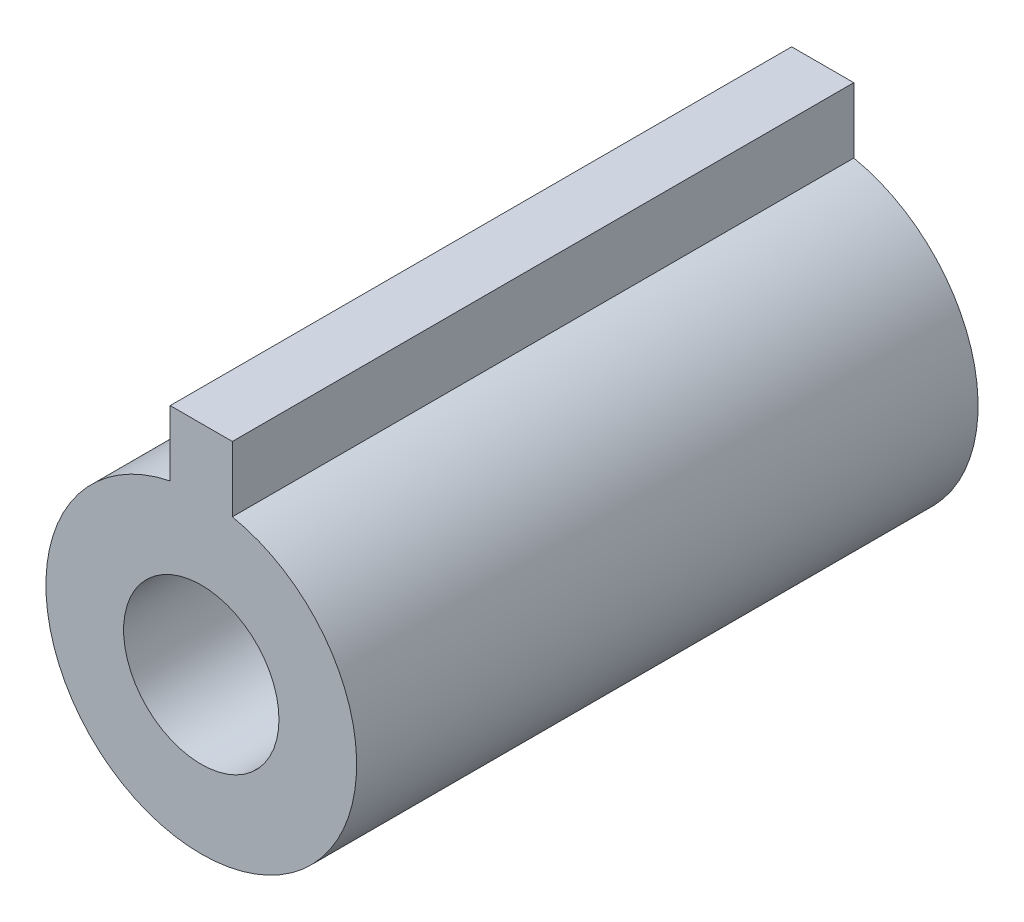
ISO-10303-21;
HEADER;
FILE_DESCRIPTION(('STEP AP214'),'2;1');
FILE_NAME('part.step','',(''),(''),'','','');
FILE_SCHEMA(('AUTOMOTIVE_DESIGN { 1 0 10303 214 1 1 1 1 }'));
ENDSEC;
DATA;
#1=APPLICATION_CONTEXT('core data for automotive mechanical design processes');
#2=APPLICATION_PROTOCOL_DEFINITION('international standard','automotive_design',2000,#1);
#3=PRODUCT_CONTEXT('',#1,'mechanical');
#4=PRODUCT('Part','Part','',(#3));
#5=PRODUCT_RELATED_PRODUCT_CATEGORY('part','',(#4));
#6=PRODUCT_DEFINITION_FORMATION('','',#4);
#7=PRODUCT_DEFINITION_CONTEXT('part definition',#1,'design');
#8=PRODUCT_DEFINITION('design','',#6,#7);
#9=PRODUCT_DEFINITION_SHAPE('','',#8);
#10=(LENGTH_UNIT() NAMED_UNIT(*) SI_UNIT(.MILLI.,.METRE.));
#11=(NAMED_UNIT(*) PLANE_ANGLE_UNIT() SI_UNIT($,.RADIAN.));
#12=(NAMED_UNIT(*) SI_UNIT($,.STERADIAN.) SOLID_ANGLE_UNIT());
#13=UNCERTAINTY_MEASURE_WITH_UNIT(LENGTH_MEASURE(1.E-05),#10,'distance_accuracy_value','');
#14=(GEOMETRIC_REPRESENTATION_CONTEXT(3) GLOBAL_UNCERTAINTY_ASSIGNED_CONTEXT((#13)) GLOBAL_UNIT_ASSIGNED_CONTEXT((#10,
#11,#12)) REPRESENTATION_CONTEXT('',''));
#15=CARTESIAN_POINT('',(0.,0.,0.));
#16=DIRECTION('',(0.,0.,1.));
#17=DIRECTION('',(1.,0.,0.));
#18=AXIS2_PLACEMENT_3D('',#15,#16,#17);
#19=CARTESIAN_POINT('',(0.,0.,20.));
#20=DIRECTION('',(0.,0.,1.));
#21=DIRECTION('',(1.,0.,0.));
#22=AXIS2_PLACEMENT_3D('',#19,#20,#21);
#23=PLANE('',#22);
#24=CARTESIAN_POINT('',(0.,0.,20.));
#25=DIRECTION('',(0.,0.,1.));
#26=DIRECTION('',(1.,0.,0.));
#27=AXIS2_PLACEMENT_3D('',#24,#25,#26);
#28=CIRCLE('',#27,5.);
#29=CARTESIAN_POINT('',(-1.,4.89897948556636,20.));
#30=VERTEX_POINT('',#29);
#31=CARTESIAN_POINT('',(1.,4.89897948556636,20.));
#32=VERTEX_POINT('',#31);
#33=EDGE_CURVE('E96',#30,#32,#28,.T.);
#34=ORIENTED_EDGE('',*,*,#33,.T.);
#35=DIRECTION('',(0.,1.,0.));
#36=VECTOR('',#35,1.);
#37=CARTESIAN_POINT('',(1.,4.89897948556636,20.));
#38=LINE('',#37,#36);
#39=CARTESIAN_POINT('',(1.,7.,20.));
#40=VERTEX_POINT('',#39);
#41=EDGE_CURVE('E91',#32,#40,#38,.T.);
#42=ORIENTED_EDGE('',*,*,#41,.T.);
#43=DIRECTION('',(-1.,0.,0.));
#44=VECTOR('',#43,1.);
#45=CARTESIAN_POINT('',(1.,7.,20.));
#46=LINE('',#45,#44);
#47=CARTESIAN_POINT('',(-1.,7.,20.));
#48=VERTEX_POINT('',#47);
#49=EDGE_CURVE('E94',#40,#48,#46,.T.);
#50=ORIENTED_EDGE('',*,*,#49,.T.);
#51=DIRECTION('',(0.,-1.,0.));
#52=VECTOR('',#51,1.);
#53=CARTESIAN_POINT('',(-1.,7.,20.));
#54=LINE('',#53,#52);
#55=EDGE_CURVE('E61',#48,#30,#54,.T.);
#56=ORIENTED_EDGE('',*,*,#55,.T.);
#57=EDGE_LOOP('',(#34,#42,#50,#56));
#58=FACE_BOUND('',#57,.T.);
#59=CARTESIAN_POINT('',(0.,0.,20.));
#60=DIRECTION('',(0.,0.,1.));
#61=DIRECTION('',(1.,0.,0.));
#62=AXIS2_PLACEMENT_3D('',#59,#60,#61);
#63=CIRCLE('',#62,2.5);
#64=CARTESIAN_POINT('',(2.5,0.,20.));
#65=VERTEX_POINT('',#64);
#66=EDGE_CURVE('E116',#65,#65,#63,.T.);
#67=ORIENTED_EDGE('',*,*,#66,.F.);
#68=EDGE_LOOP('',(#67));
#69=FACE_BOUND('',#68,.T.);
#70=ADVANCED_FACE('F43',(#58,#69),#23,.T.);
#71=CARTESIAN_POINT('',(0.,0.,0.));
#72=DIRECTION('',(0.,0.,1.));
#73=DIRECTION('',(1.,0.,0.));
#74=AXIS2_PLACEMENT_3D('',#71,#72,#73);
#75=PLANE('',#74);
#76=CARTESIAN_POINT('',(0.,0.,0.));
#77=DIRECTION('',(0.,0.,1.));
#78=DIRECTION('',(1.,0.,0.));
#79=AXIS2_PLACEMENT_3D('',#76,#77,#78);
#80=CIRCLE('',#79,5.);
#81=CARTESIAN_POINT('',(-1.,4.89897948556636,0.));
#82=VERTEX_POINT('',#81);
#83=CARTESIAN_POINT('',(1.,4.89897948556636,0.));
#84=VERTEX_POINT('',#83);
#85=EDGE_CURVE('E112',#82,#84,#80,.T.);
#86=ORIENTED_EDGE('',*,*,#85,.F.);
#87=DIRECTION('',(0.,-1.,0.));
#88=VECTOR('',#87,1.);
#89=CARTESIAN_POINT('',(-1.,7.,0.));
#90=LINE('',#89,#88);
#91=CARTESIAN_POINT('',(-1.,7.,0.));
#92=VERTEX_POINT('',#91);
#93=EDGE_CURVE('E84',#92,#82,#90,.T.);
#94=ORIENTED_EDGE('',*,*,#93,.F.);
#95=DIRECTION('',(-1.,0.,0.));
#96=VECTOR('',#95,1.);
#97=CARTESIAN_POINT('',(1.,7.,0.));
#98=LINE('',#97,#96);
#99=CARTESIAN_POINT('',(1.,7.,0.));
#100=VERTEX_POINT('',#99);
#101=EDGE_CURVE('E78',#100,#92,#98,.T.);
#102=ORIENTED_EDGE('',*,*,#101,.F.);
#103=DIRECTION('',(0.,1.,0.));
#104=VECTOR('',#103,1.);
#105=CARTESIAN_POINT('',(1.,4.89897948556636,0.));
#106=LINE('',#105,#104);
#107=EDGE_CURVE('E101',#84,#100,#106,.T.);
#108=ORIENTED_EDGE('',*,*,#107,.F.);
#109=EDGE_LOOP('',(#86,#94,#102,#108));
#110=FACE_BOUND('',#109,.T.);
#111=CARTESIAN_POINT('',(0.,0.,0.));
#112=DIRECTION('',(0.,0.,1.));
#113=DIRECTION('',(1.,0.,0.));
#114=AXIS2_PLACEMENT_3D('',#111,#112,#113);
#115=CIRCLE('',#114,2.5);
#116=CARTESIAN_POINT('',(2.5,0.,0.));
#117=VERTEX_POINT('',#116);
#118=EDGE_CURVE('E134',#117,#117,#115,.T.);
#119=ORIENTED_EDGE('',*,*,#118,.T.);
#120=EDGE_LOOP('',(#119));
#121=FACE_BOUND('',#120,.T.);
#122=ADVANCED_FACE('F129',(#110,#121),#75,.F.);
#123=CARTESIAN_POINT('',(0.,0.,20.));
#124=DIRECTION('',(0.,0.,-1.));
#125=DIRECTION('',(-1.,0.,0.));
#126=AXIS2_PLACEMENT_3D('',#123,#124,#125);
#127=CYLINDRICAL_SURFACE('',#126,5.);
#128=ORIENTED_EDGE('',*,*,#85,.T.);
#129=DIRECTION('',(0.,0.,-1.));
#130=VECTOR('',#129,1.);
#131=CARTESIAN_POINT('',(1.,4.89897948556636,20.));
#132=LINE('',#131,#130);
#133=EDGE_CURVE('E11',#32,#84,#132,.T.);
#134=ORIENTED_EDGE('',*,*,#133,.F.);
#135=ORIENTED_EDGE('',*,*,#33,.F.);
#136=DIRECTION('',(0.,0.,-1.));
#137=VECTOR('',#136,1.);
#138=CARTESIAN_POINT('',(-1.,4.89897948556636,20.));
#139=LINE('',#138,#137);
#140=EDGE_CURVE('E108',#30,#82,#139,.T.);
#141=ORIENTED_EDGE('',*,*,#140,.T.);
#142=EDGE_LOOP('',(#128,#134,#135,#141));
#143=FACE_BOUND('',#142,.T.);
#144=ADVANCED_FACE('F45',(#143),#127,.T.);
#145=CARTESIAN_POINT('',(1.,4.89897948556636,20.));
#146=DIRECTION('',(-1.,0.,0.));
#147=DIRECTION('',(0.,0.,1.));
#148=AXIS2_PLACEMENT_3D('',#145,#146,#147);
#149=PLANE('',#148);
#150=ORIENTED_EDGE('',*,*,#107,.T.);
#151=DIRECTION('',(0.,0.,-1.));
#152=VECTOR('',#151,1.);
#153=CARTESIAN_POINT('',(1.,7.,20.));
#154=LINE('',#153,#152);
#155=EDGE_CURVE('E53',#40,#100,#154,.T.);
#156=ORIENTED_EDGE('',*,*,#155,.F.);
#157=ORIENTED_EDGE('',*,*,#41,.F.);
#158=ORIENTED_EDGE('',*,*,#133,.T.);
#159=EDGE_LOOP('',(#150,#156,#157,#158));
#160=FACE_BOUND('',#159,.T.);
#161=ADVANCED_FACE('F100',(#160),#149,.F.);
#162=CARTESIAN_POINT('',(1.,7.,20.));
#163=DIRECTION('',(0.,-1.,0.));
#164=DIRECTION('',(0.,0.,-1.));
#165=AXIS2_PLACEMENT_3D('',#162,#163,#164);
#166=PLANE('',#165);
#167=ORIENTED_EDGE('',*,*,#101,.T.);
#168=DIRECTION('',(0.,0.,-1.));
#169=VECTOR('',#168,1.);
#170=CARTESIAN_POINT('',(-1.,7.,20.));
#171=LINE('',#170,#169);
#172=EDGE_CURVE('E103',#48,#92,#171,.T.);
#173=ORIENTED_EDGE('',*,*,#172,.F.);
#174=ORIENTED_EDGE('',*,*,#49,.F.);
#175=ORIENTED_EDGE('',*,*,#155,.T.);
#176=EDGE_LOOP('',(#167,#173,#174,#175));
#177=FACE_BOUND('',#176,.T.);
#178=ADVANCED_FACE('F104',(#177),#166,.F.);
#179=CARTESIAN_POINT('',(-1.,7.,20.));
#180=DIRECTION('',(1.,0.,0.));
#181=DIRECTION('',(0.,0.,-1.));
#182=AXIS2_PLACEMENT_3D('',#179,#180,#181);
#183=PLANE('',#182);
#184=ORIENTED_EDGE('',*,*,#93,.T.);
#185=ORIENTED_EDGE('',*,*,#140,.F.);
#186=ORIENTED_EDGE('',*,*,#55,.F.);
#187=ORIENTED_EDGE('',*,*,#172,.T.);
#188=EDGE_LOOP('',(#184,#185,#186,#187));
#189=FACE_BOUND('',#188,.T.);
#190=ADVANCED_FACE('F126',(#189),#183,.F.);
#191=CARTESIAN_POINT('',(0.,0.,20.));
#192=DIRECTION('',(0.,0.,-1.));
#193=DIRECTION('',(-1.,0.,0.));
#194=AXIS2_PLACEMENT_3D('',#191,#192,#193);
#195=CYLINDRICAL_SURFACE('',#194,2.5);
#196=ORIENTED_EDGE('',*,*,#66,.T.);
#197=EDGE_LOOP('',(#196));
#198=FACE_BOUND('',#197,.T.);
#199=ORIENTED_EDGE('',*,*,#118,.F.);
#200=EDGE_LOOP('',(#199));
#201=FACE_BOUND('',#200,.T.);
#202=ADVANCED_FACE('F142',(#198,#201),#195,.F.);
#203=CLOSED_SHELL('',(#70,#122,#144,#161,#178,#190,#202));
#204=MANIFOLD_SOLID_BREP('B2',#203);
#205=ADVANCED_BREP_SHAPE_REPRESENTATION('',(#18,#204),#14);
#206=SHAPE_DEFINITION_REPRESENTATION(#9,#205);
ENDSEC;
END-ISO-10303-21;
